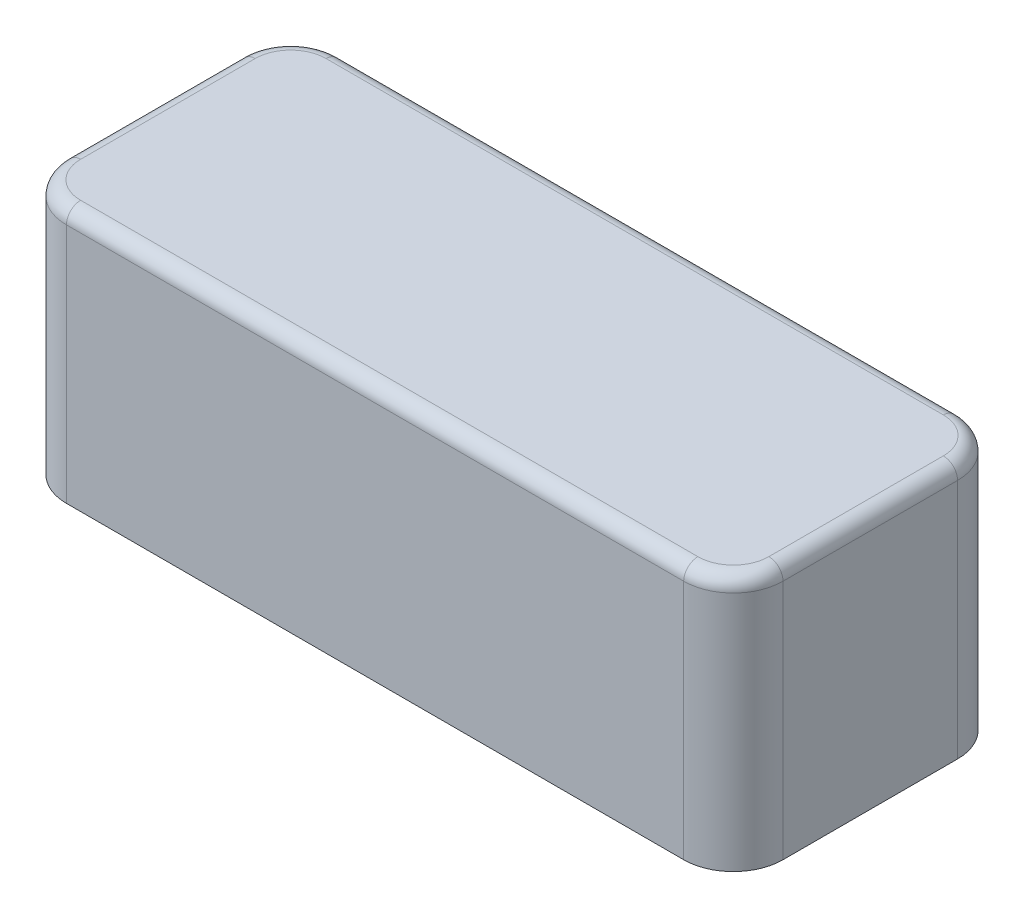
ISO-10303-21;
HEADER;
FILE_DESCRIPTION(('STEP AP214'),'2;1');
FILE_NAME('part.step','',(''),(''),'','','');
FILE_SCHEMA(('AUTOMOTIVE_DESIGN { 1 0 10303 214 1 1 1 1 }'));
ENDSEC;
DATA;
#1=APPLICATION_CONTEXT('core data for automotive mechanical design processes');
#2=APPLICATION_PROTOCOL_DEFINITION('international standard','automotive_design',2000,#1);
#3=PRODUCT_CONTEXT('',#1,'mechanical');
#4=PRODUCT('Part','Part','',(#3));
#5=PRODUCT_RELATED_PRODUCT_CATEGORY('part','',(#4));
#6=PRODUCT_DEFINITION_FORMATION('','',#4);
#7=PRODUCT_DEFINITION_CONTEXT('part definition',#1,'design');
#8=PRODUCT_DEFINITION('design','',#6,#7);
#9=PRODUCT_DEFINITION_SHAPE('','',#8);
#10=(LENGTH_UNIT() NAMED_UNIT(*) SI_UNIT(.MILLI.,.METRE.));
#11=(NAMED_UNIT(*) PLANE_ANGLE_UNIT() SI_UNIT($,.RADIAN.));
#12=(NAMED_UNIT(*) SI_UNIT($,.STERADIAN.) SOLID_ANGLE_UNIT());
#13=UNCERTAINTY_MEASURE_WITH_UNIT(LENGTH_MEASURE(1.E-05),#10,'distance_accuracy_value','');
#14=(GEOMETRIC_REPRESENTATION_CONTEXT(3) GLOBAL_UNCERTAINTY_ASSIGNED_CONTEXT((#13)) GLOBAL_UNIT_ASSIGNED_CONTEXT((#10,
#11,#12)) REPRESENTATION_CONTEXT('',''));
#15=CARTESIAN_POINT('',(0.,0.,0.));
#16=DIRECTION('',(0.,0.,1.));
#17=DIRECTION('',(1.,0.,0.));
#18=AXIS2_PLACEMENT_3D('',#15,#16,#17);
#19=CARTESIAN_POINT('',(-505.,350.,0.));
#20=DIRECTION('',(-1.,0.,0.));
#21=DIRECTION('',(0.,0.,1.));
#22=AXIS2_PLACEMENT_3D('',#19,#20,#21);
#23=PLANE('',#22);
#24=DIRECTION('',(0.,-1.,0.));
#25=VECTOR('',#24,1.);
#26=CARTESIAN_POINT('',(-505.,350.,123.));
#27=LINE('',#26,#25);
#28=CARTESIAN_POINT('',(-505.,340.,123.));
#29=VERTEX_POINT('',#28);
#30=CARTESIAN_POINT('',(-505.,0.,123.));
#31=VERTEX_POINT('',#30);
#32=EDGE_CURVE('E262',#29,#31,#27,.T.);
#33=ORIENTED_EDGE('',*,*,#32,.F.);
#34=DIRECTION('',(0.,0.,1.));
#35=VECTOR('',#34,1.);
#36=CARTESIAN_POINT('',(-505.,340.,-123.));
#37=LINE('',#36,#35);
#38=CARTESIAN_POINT('',(-505.,340.,-123.));
#39=VERTEX_POINT('',#38);
#40=EDGE_CURVE('E297',#29,#39,#37,.F.);
#41=ORIENTED_EDGE('',*,*,#40,.T.);
#42=DIRECTION('',(0.,-1.,0.));
#43=VECTOR('',#42,1.);
#44=CARTESIAN_POINT('',(-505.,350.,-123.));
#45=LINE('',#44,#43);
#46=CARTESIAN_POINT('',(-505.,0.,-123.));
#47=VERTEX_POINT('',#46);
#48=EDGE_CURVE('E248',#39,#47,#45,.T.);
#49=ORIENTED_EDGE('',*,*,#48,.T.);
#50=DIRECTION('',(0.,0.,-1.));
#51=VECTOR('',#50,1.);
#52=CARTESIAN_POINT('',(-505.,0.,0.));
#53=LINE('',#52,#51);
#54=EDGE_CURVE('E225',#31,#47,#53,.T.);
#55=ORIENTED_EDGE('',*,*,#54,.F.);
#56=EDGE_LOOP('',(#33,#41,#49,#55));
#57=FACE_BOUND('',#56,.T.);
#58=ADVANCED_FACE('F35',(#57),#23,.T.);
#59=CARTESIAN_POINT('',(-435.,350.,123.));
#60=DIRECTION('',(0.,-1.,0.));
#61=DIRECTION('',(0.,0.,-1.));
#62=AXIS2_PLACEMENT_3D('',#59,#60,#61);
#63=CYLINDRICAL_SURFACE('',#62,70.);
#64=DIRECTION('',(0.,-1.,0.));
#65=VECTOR('',#64,1.);
#66=CARTESIAN_POINT('',(-435.,350.,193.));
#67=LINE('',#66,#65);
#68=CARTESIAN_POINT('',(-435.,340.,193.));
#69=VERTEX_POINT('',#68);
#70=CARTESIAN_POINT('',(-435.,0.,193.));
#71=VERTEX_POINT('',#70);
#72=EDGE_CURVE('E260',#69,#71,#67,.T.);
#73=ORIENTED_EDGE('',*,*,#72,.F.);
#74=CARTESIAN_POINT('',(-435.,340.,123.));
#75=DIRECTION('',(0.,-1.,0.));
#76=DIRECTION('',(0.,0.,-1.));
#77=AXIS2_PLACEMENT_3D('',#74,#75,#76);
#78=CIRCLE('',#77,70.);
#79=EDGE_CURVE('E294',#69,#29,#78,.T.);
#80=ORIENTED_EDGE('',*,*,#79,.T.);
#81=ORIENTED_EDGE('',*,*,#32,.T.);
#82=CARTESIAN_POINT('',(-435.,0.,123.));
#83=DIRECTION('',(0.,1.,0.));
#84=DIRECTION('',(0.,0.,1.));
#85=AXIS2_PLACEMENT_3D('',#82,#83,#84);
#86=CIRCLE('',#85,70.);
#87=EDGE_CURVE('E228',#31,#71,#86,.T.);
#88=ORIENTED_EDGE('',*,*,#87,.T.);
#89=EDGE_LOOP('',(#73,#80,#81,#88));
#90=FACE_BOUND('',#89,.T.);
#91=ADVANCED_FACE('F356',(#90),#63,.T.);
#92=CARTESIAN_POINT('',(0.,350.,193.));
#93=DIRECTION('',(0.,0.,-1.));
#94=DIRECTION('',(-1.,0.,0.));
#95=AXIS2_PLACEMENT_3D('',#92,#93,#94);
#96=PLANE('',#95);
#97=DIRECTION('',(0.,-1.,0.));
#98=VECTOR('',#97,1.);
#99=CARTESIAN_POINT('',(434.999999999999,350.,193.));
#100=LINE('',#99,#98);
#101=CARTESIAN_POINT('',(434.999999999999,340.,193.));
#102=VERTEX_POINT('',#101);
#103=CARTESIAN_POINT('',(434.999999999999,0.,193.));
#104=VERTEX_POINT('',#103);
#105=EDGE_CURVE('E258',#102,#104,#100,.T.);
#106=ORIENTED_EDGE('',*,*,#105,.F.);
#107=DIRECTION('',(1.,0.,0.));
#108=VECTOR('',#107,1.);
#109=CARTESIAN_POINT('',(0.,340.,193.));
#110=LINE('',#109,#108);
#111=EDGE_CURVE('E11',#102,#69,#110,.F.);
#112=ORIENTED_EDGE('',*,*,#111,.T.);
#113=ORIENTED_EDGE('',*,*,#72,.T.);
#114=DIRECTION('',(1.,0.,0.));
#115=VECTOR('',#114,1.);
#116=CARTESIAN_POINT('',(0.,0.,193.));
#117=LINE('',#116,#115);
#118=EDGE_CURVE('E231',#71,#104,#117,.T.);
#119=ORIENTED_EDGE('',*,*,#118,.T.);
#120=EDGE_LOOP('',(#106,#112,#113,#119));
#121=FACE_BOUND('',#120,.T.);
#122=ADVANCED_FACE('F351',(#121),#96,.F.);
#123=CARTESIAN_POINT('',(435.,350.,123.));
#124=DIRECTION('',(0.,-1.,0.));
#125=DIRECTION('',(0.,0.,-1.));
#126=AXIS2_PLACEMENT_3D('',#123,#124,#125);
#127=CYLINDRICAL_SURFACE('',#126,70.);
#128=DIRECTION('',(0.,-1.,0.));
#129=VECTOR('',#128,1.);
#130=CARTESIAN_POINT('',(505.,350.,123.));
#131=LINE('',#130,#129);
#132=CARTESIAN_POINT('',(505.,340.,123.));
#133=VERTEX_POINT('',#132);
#134=CARTESIAN_POINT('',(505.,0.,123.));
#135=VERTEX_POINT('',#134);
#136=EDGE_CURVE('E256',#133,#135,#131,.T.);
#137=ORIENTED_EDGE('',*,*,#136,.F.);
#138=CARTESIAN_POINT('',(435.,340.,123.));
#139=DIRECTION('',(0.,-1.,0.));
#140=DIRECTION('',(0.,0.,-1.));
#141=AXIS2_PLACEMENT_3D('',#138,#139,#140);
#142=CIRCLE('',#141,70.);
#143=EDGE_CURVE('E44',#133,#102,#142,.T.);
#144=ORIENTED_EDGE('',*,*,#143,.T.);
#145=ORIENTED_EDGE('',*,*,#105,.T.);
#146=CARTESIAN_POINT('',(435.,0.,123.));
#147=DIRECTION('',(0.,1.,0.));
#148=DIRECTION('',(0.,0.,1.));
#149=AXIS2_PLACEMENT_3D('',#146,#147,#148);
#150=CIRCLE('',#149,70.);
#151=EDGE_CURVE('E234',#135,#104,#150,.F.);
#152=ORIENTED_EDGE('',*,*,#151,.F.);
#153=EDGE_LOOP('',(#137,#144,#145,#152));
#154=FACE_BOUND('',#153,.T.);
#155=ADVANCED_FACE('F347',(#154),#127,.T.);
#156=CARTESIAN_POINT('',(505.,350.,0.));
#157=DIRECTION('',(-1.,0.,0.));
#158=DIRECTION('',(0.,0.,1.));
#159=AXIS2_PLACEMENT_3D('',#156,#157,#158);
#160=PLANE('',#159);
#161=DIRECTION('',(0.,-1.,0.));
#162=VECTOR('',#161,1.);
#163=CARTESIAN_POINT('',(505.,350.,-123.));
#164=LINE('',#163,#162);
#165=CARTESIAN_POINT('',(505.,340.,-123.));
#166=VERTEX_POINT('',#165);
#167=CARTESIAN_POINT('',(505.,0.,-123.));
#168=VERTEX_POINT('',#167);
#169=EDGE_CURVE('E254',#166,#168,#164,.T.);
#170=ORIENTED_EDGE('',*,*,#169,.F.);
#171=DIRECTION('',(0.,0.,-1.));
#172=VECTOR('',#171,1.);
#173=CARTESIAN_POINT('',(505.,340.,0.));
#174=LINE('',#173,#172);
#175=EDGE_CURVE('E59',#166,#133,#174,.F.);
#176=ORIENTED_EDGE('',*,*,#175,.T.);
#177=ORIENTED_EDGE('',*,*,#136,.T.);
#178=DIRECTION('',(0.,0.,-1.));
#179=VECTOR('',#178,1.);
#180=CARTESIAN_POINT('',(505.,0.,0.));
#181=LINE('',#180,#179);
#182=EDGE_CURVE('E237',#135,#168,#181,.T.);
#183=ORIENTED_EDGE('',*,*,#182,.T.);
#184=EDGE_LOOP('',(#170,#176,#177,#183));
#185=FACE_BOUND('',#184,.T.);
#186=ADVANCED_FACE('F341',(#185),#160,.F.);
#187=CARTESIAN_POINT('',(435.,350.,-123.));
#188=DIRECTION('',(0.,-1.,0.));
#189=DIRECTION('',(0.,0.,-1.));
#190=AXIS2_PLACEMENT_3D('',#187,#188,#189);
#191=CYLINDRICAL_SURFACE('',#190,70.);
#192=DIRECTION('',(0.,-1.,0.));
#193=VECTOR('',#192,1.);
#194=CARTESIAN_POINT('',(435.,350.,-193.));
#195=LINE('',#194,#193);
#196=CARTESIAN_POINT('',(435.,340.,-193.));
#197=VERTEX_POINT('',#196);
#198=CARTESIAN_POINT('',(435.,0.,-193.));
#199=VERTEX_POINT('',#198);
#200=EDGE_CURVE('E252',#197,#199,#195,.T.);
#201=ORIENTED_EDGE('',*,*,#200,.F.);
#202=CARTESIAN_POINT('',(435.,340.,-123.));
#203=DIRECTION('',(0.,-1.,0.));
#204=DIRECTION('',(0.,0.,-1.));
#205=AXIS2_PLACEMENT_3D('',#202,#203,#204);
#206=CIRCLE('',#205,70.);
#207=EDGE_CURVE('E303',#197,#166,#206,.T.);
#208=ORIENTED_EDGE('',*,*,#207,.T.);
#209=ORIENTED_EDGE('',*,*,#169,.T.);
#210=CARTESIAN_POINT('',(435.,0.,-123.));
#211=DIRECTION('',(0.,1.,0.));
#212=DIRECTION('',(0.,0.,1.));
#213=AXIS2_PLACEMENT_3D('',#210,#211,#212);
#214=CIRCLE('',#213,70.);
#215=EDGE_CURVE('E240',#168,#199,#214,.T.);
#216=ORIENTED_EDGE('',*,*,#215,.T.);
#217=EDGE_LOOP('',(#201,#208,#209,#216));
#218=FACE_BOUND('',#217,.T.);
#219=ADVANCED_FACE('F339',(#218),#191,.T.);
#220=CARTESIAN_POINT('',(0.,350.,-193.));
#221=DIRECTION('',(0.,0.,-1.));
#222=DIRECTION('',(-1.,0.,0.));
#223=AXIS2_PLACEMENT_3D('',#220,#221,#222);
#224=PLANE('',#223);
#225=DIRECTION('',(0.,-1.,0.));
#226=VECTOR('',#225,1.);
#227=CARTESIAN_POINT('',(-435.,350.,-193.));
#228=LINE('',#227,#226);
#229=CARTESIAN_POINT('',(-435.,340.,-193.));
#230=VERTEX_POINT('',#229);
#231=CARTESIAN_POINT('',(-435.,0.,-193.));
#232=VERTEX_POINT('',#231);
#233=EDGE_CURVE('E250',#230,#232,#228,.T.);
#234=ORIENTED_EDGE('',*,*,#233,.F.);
#235=DIRECTION('',(-1.,0.,0.));
#236=VECTOR('',#235,1.);
#237=CARTESIAN_POINT('',(434.999999999999,340.,-193.));
#238=LINE('',#237,#236);
#239=EDGE_CURVE('E301',#230,#197,#238,.F.);
#240=ORIENTED_EDGE('',*,*,#239,.T.);
#241=ORIENTED_EDGE('',*,*,#200,.T.);
#242=DIRECTION('',(1.,0.,0.));
#243=VECTOR('',#242,1.);
#244=CARTESIAN_POINT('',(0.,0.,-193.));
#245=LINE('',#244,#243);
#246=EDGE_CURVE('E243',#232,#199,#245,.T.);
#247=ORIENTED_EDGE('',*,*,#246,.F.);
#248=EDGE_LOOP('',(#234,#240,#241,#247));
#249=FACE_BOUND('',#248,.T.);
#250=ADVANCED_FACE('F369',(#249),#224,.T.);
#251=CARTESIAN_POINT('',(435.,350.,-123.));
#252=DIRECTION('',(0.,-1.,0.));
#253=DIRECTION('',(0.,0.,-1.));
#254=AXIS2_PLACEMENT_3D('',#251,#252,#253);
#255=CYLINDRICAL_SURFACE('',#254,60.);
#256=CARTESIAN_POINT('',(435.,0.,-123.));
#257=DIRECTION('',(0.,1.,0.));
#258=DIRECTION('',(0.,0.,1.));
#259=AXIS2_PLACEMENT_3D('',#256,#257,#258);
#260=CIRCLE('',#259,60.);
#261=CARTESIAN_POINT('',(495.,0.,-123.));
#262=VERTEX_POINT('',#261);
#263=CARTESIAN_POINT('',(435.,0.,-183.));
#264=VERTEX_POINT('',#263);
#265=EDGE_CURVE('E206',#262,#264,#260,.T.);
#266=ORIENTED_EDGE('',*,*,#265,.F.);
#267=DIRECTION('',(0.,-1.,0.));
#268=VECTOR('',#267,1.);
#269=CARTESIAN_POINT('',(495.,350.,-123.));
#270=LINE('',#269,#268);
#271=CARTESIAN_POINT('',(495.,350.,-123.));
#272=VERTEX_POINT('',#271);
#273=EDGE_CURVE('E178',#272,#262,#270,.T.);
#274=ORIENTED_EDGE('',*,*,#273,.F.);
#275=CARTESIAN_POINT('',(435.,350.,-123.));
#276=DIRECTION('',(0.,1.,0.));
#277=DIRECTION('',(0.,0.,1.));
#278=AXIS2_PLACEMENT_3D('',#275,#276,#277);
#279=CIRCLE('',#278,60.);
#280=CARTESIAN_POINT('',(435.,350.,-183.));
#281=VERTEX_POINT('',#280);
#282=EDGE_CURVE('E172',#272,#281,#279,.T.);
#283=ORIENTED_EDGE('',*,*,#282,.T.);
#284=DIRECTION('',(0.,-1.,0.));
#285=VECTOR('',#284,1.);
#286=CARTESIAN_POINT('',(435.,350.,-183.));
#287=LINE('',#286,#285);
#288=EDGE_CURVE('E176',#281,#264,#287,.T.);
#289=ORIENTED_EDGE('',*,*,#288,.T.);
#290=EDGE_LOOP('',(#266,#274,#283,#289));
#291=FACE_BOUND('',#290,.T.);
#292=ADVANCED_FACE('F175',(#291),#255,.F.);
#293=CARTESIAN_POINT('',(495.,350.,0.));
#294=DIRECTION('',(-1.,0.,0.));
#295=DIRECTION('',(0.,0.,1.));
#296=AXIS2_PLACEMENT_3D('',#293,#294,#295);
#297=PLANE('',#296);
#298=DIRECTION('',(0.,0.,-1.));
#299=VECTOR('',#298,1.);
#300=CARTESIAN_POINT('',(495.,0.,0.));
#301=LINE('',#300,#299);
#302=CARTESIAN_POINT('',(495.,0.,123.));
#303=VERTEX_POINT('',#302);
#304=EDGE_CURVE('E208',#303,#262,#301,.T.);
#305=ORIENTED_EDGE('',*,*,#304,.F.);
#306=DIRECTION('',(0.,-1.,0.));
#307=VECTOR('',#306,1.);
#308=CARTESIAN_POINT('',(495.,350.,123.));
#309=LINE('',#308,#307);
#310=CARTESIAN_POINT('',(495.,350.,123.));
#311=VERTEX_POINT('',#310);
#312=EDGE_CURVE('E275',#311,#303,#309,.T.);
#313=ORIENTED_EDGE('',*,*,#312,.F.);
#314=DIRECTION('',(0.,0.,-1.));
#315=VECTOR('',#314,1.);
#316=CARTESIAN_POINT('',(495.,350.,0.));
#317=LINE('',#316,#315);
#318=EDGE_CURVE('E183',#311,#272,#317,.T.);
#319=ORIENTED_EDGE('',*,*,#318,.T.);
#320=ORIENTED_EDGE('',*,*,#273,.T.);
#321=EDGE_LOOP('',(#305,#313,#319,#320));
#322=FACE_BOUND('',#321,.T.);
#323=ADVANCED_FACE('F376',(#322),#297,.T.);
#324=CARTESIAN_POINT('',(435.,350.,123.));
#325=DIRECTION('',(0.,-1.,0.));
#326=DIRECTION('',(0.,0.,-1.));
#327=AXIS2_PLACEMENT_3D('',#324,#325,#326);
#328=CYLINDRICAL_SURFACE('',#327,60.);
#329=CARTESIAN_POINT('',(435.,0.,123.));
#330=DIRECTION('',(0.,1.,0.));
#331=DIRECTION('',(0.,0.,1.));
#332=AXIS2_PLACEMENT_3D('',#329,#330,#331);
#333=CIRCLE('',#332,60.);
#334=CARTESIAN_POINT('',(435.,0.,183.));
#335=VERTEX_POINT('',#334);
#336=EDGE_CURVE('E211',#303,#335,#333,.F.);
#337=ORIENTED_EDGE('',*,*,#336,.T.);
#338=DIRECTION('',(0.,-1.,0.));
#339=VECTOR('',#338,1.);
#340=CARTESIAN_POINT('',(435.,350.,183.));
#341=LINE('',#340,#339);
#342=CARTESIAN_POINT('',(435.,350.,183.));
#343=VERTEX_POINT('',#342);
#344=EDGE_CURVE('E273',#343,#335,#341,.T.);
#345=ORIENTED_EDGE('',*,*,#344,.F.);
#346=CARTESIAN_POINT('',(435.,350.,123.));
#347=DIRECTION('',(0.,1.,0.));
#348=DIRECTION('',(0.,0.,1.));
#349=AXIS2_PLACEMENT_3D('',#346,#347,#348);
#350=CIRCLE('',#349,60.);
#351=EDGE_CURVE('E639',#311,#343,#350,.F.);
#352=ORIENTED_EDGE('',*,*,#351,.F.);
#353=ORIENTED_EDGE('',*,*,#312,.T.);
#354=EDGE_LOOP('',(#337,#345,#352,#353));
#355=FACE_BOUND('',#354,.T.);
#356=ADVANCED_FACE('F405',(#355),#328,.F.);
#357=CARTESIAN_POINT('',(0.,350.,183.));
#358=DIRECTION('',(0.,0.,-1.));
#359=DIRECTION('',(-1.,0.,0.));
#360=AXIS2_PLACEMENT_3D('',#357,#358,#359);
#361=PLANE('',#360);
#362=DIRECTION('',(1.,0.,0.));
#363=VECTOR('',#362,1.);
#364=CARTESIAN_POINT('',(0.,0.,183.));
#365=LINE('',#364,#363);
#366=CARTESIAN_POINT('',(-435.,0.,183.));
#367=VERTEX_POINT('',#366);
#368=EDGE_CURVE('E214',#367,#335,#365,.T.);
#369=ORIENTED_EDGE('',*,*,#368,.F.);
#370=DIRECTION('',(0.,-1.,0.));
#371=VECTOR('',#370,1.);
#372=CARTESIAN_POINT('',(-435.,350.,183.));
#373=LINE('',#372,#371);
#374=CARTESIAN_POINT('',(-435.,350.,183.));
#375=VERTEX_POINT('',#374);
#376=EDGE_CURVE('E271',#375,#367,#373,.T.);
#377=ORIENTED_EDGE('',*,*,#376,.F.);
#378=DIRECTION('',(1.,0.,0.));
#379=VECTOR('',#378,1.);
#380=CARTESIAN_POINT('',(0.,350.,183.));
#381=LINE('',#380,#379);
#382=EDGE_CURVE('E641',#375,#343,#381,.T.);
#383=ORIENTED_EDGE('',*,*,#382,.T.);
#384=ORIENTED_EDGE('',*,*,#344,.T.);
#385=EDGE_LOOP('',(#369,#377,#383,#384));
#386=FACE_BOUND('',#385,.T.);
#387=ADVANCED_FACE('F401',(#386),#361,.T.);
#388=CARTESIAN_POINT('',(-435.,350.,123.));
#389=DIRECTION('',(0.,-1.,0.));
#390=DIRECTION('',(0.,0.,-1.));
#391=AXIS2_PLACEMENT_3D('',#388,#389,#390);
#392=CYLINDRICAL_SURFACE('',#391,60.);
#393=CARTESIAN_POINT('',(-435.,0.,123.));
#394=DIRECTION('',(0.,1.,0.));
#395=DIRECTION('',(0.,0.,1.));
#396=AXIS2_PLACEMENT_3D('',#393,#394,#395);
#397=CIRCLE('',#396,60.);
#398=CARTESIAN_POINT('',(-495.,0.,123.));
#399=VERTEX_POINT('',#398);
#400=EDGE_CURVE('E217',#399,#367,#397,.T.);
#401=ORIENTED_EDGE('',*,*,#400,.F.);
#402=DIRECTION('',(0.,-1.,0.));
#403=VECTOR('',#402,1.);
#404=CARTESIAN_POINT('',(-495.,350.,123.));
#405=LINE('',#404,#403);
#406=CARTESIAN_POINT('',(-495.,350.,123.));
#407=VERTEX_POINT('',#406);
#408=EDGE_CURVE('E269',#407,#399,#405,.T.);
#409=ORIENTED_EDGE('',*,*,#408,.F.);
#410=CARTESIAN_POINT('',(-435.,350.,123.));
#411=DIRECTION('',(0.,1.,0.));
#412=DIRECTION('',(0.,0.,1.));
#413=AXIS2_PLACEMENT_3D('',#410,#411,#412);
#414=CIRCLE('',#413,60.);
#415=EDGE_CURVE('E646',#407,#375,#414,.T.);
#416=ORIENTED_EDGE('',*,*,#415,.T.);
#417=ORIENTED_EDGE('',*,*,#376,.T.);
#418=EDGE_LOOP('',(#401,#409,#416,#417));
#419=FACE_BOUND('',#418,.T.);
#420=ADVANCED_FACE('F397',(#419),#392,.F.);
#421=CARTESIAN_POINT('',(-495.,350.,0.));
#422=DIRECTION('',(-1.,0.,0.));
#423=DIRECTION('',(0.,0.,1.));
#424=AXIS2_PLACEMENT_3D('',#421,#422,#423);
#425=PLANE('',#424);
#426=DIRECTION('',(0.,0.,-1.));
#427=VECTOR('',#426,1.);
#428=CARTESIAN_POINT('',(-495.,0.,0.));
#429=LINE('',#428,#427);
#430=CARTESIAN_POINT('',(-495.,0.,-123.));
#431=VERTEX_POINT('',#430);
#432=EDGE_CURVE('E220',#399,#431,#429,.T.);
#433=ORIENTED_EDGE('',*,*,#432,.T.);
#434=DIRECTION('',(0.,-1.,0.));
#435=VECTOR('',#434,1.);
#436=CARTESIAN_POINT('',(-495.,350.,-123.));
#437=LINE('',#436,#435);
#438=CARTESIAN_POINT('',(-495.,350.,-123.));
#439=VERTEX_POINT('',#438);
#440=EDGE_CURVE('E266',#439,#431,#437,.T.);
#441=ORIENTED_EDGE('',*,*,#440,.F.);
#442=DIRECTION('',(0.,0.,-1.));
#443=VECTOR('',#442,1.);
#444=CARTESIAN_POINT('',(-495.,350.,0.));
#445=LINE('',#444,#443);
#446=EDGE_CURVE('E202',#407,#439,#445,.T.);
#447=ORIENTED_EDGE('',*,*,#446,.F.);
#448=ORIENTED_EDGE('',*,*,#408,.T.);
#449=EDGE_LOOP('',(#433,#441,#447,#448));
#450=FACE_BOUND('',#449,.T.);
#451=ADVANCED_FACE('F393',(#450),#425,.F.);
#452=CARTESIAN_POINT('',(-435.,350.,-123.));
#453=DIRECTION('',(0.,-1.,0.));
#454=DIRECTION('',(0.,0.,-1.));
#455=AXIS2_PLACEMENT_3D('',#452,#453,#454);
#456=CYLINDRICAL_SURFACE('',#455,60.);
#457=CARTESIAN_POINT('',(-435.,0.,-123.));
#458=DIRECTION('',(0.,1.,0.));
#459=DIRECTION('',(0.,0.,1.));
#460=AXIS2_PLACEMENT_3D('',#457,#458,#459);
#461=CIRCLE('',#460,60.);
#462=CARTESIAN_POINT('',(-435.,0.,-183.));
#463=VERTEX_POINT('',#462);
#464=EDGE_CURVE('E222',#431,#463,#461,.F.);
#465=ORIENTED_EDGE('',*,*,#464,.T.);
#466=DIRECTION('',(0.,-1.,0.));
#467=VECTOR('',#466,1.);
#468=CARTESIAN_POINT('',(-435.,350.,-183.));
#469=LINE('',#468,#467);
#470=CARTESIAN_POINT('',(-435.,350.,-183.));
#471=VERTEX_POINT('',#470);
#472=EDGE_CURVE('E195',#471,#463,#469,.T.);
#473=ORIENTED_EDGE('',*,*,#472,.F.);
#474=CARTESIAN_POINT('',(-435.,350.,-123.));
#475=DIRECTION('',(0.,1.,0.));
#476=DIRECTION('',(0.,0.,1.));
#477=AXIS2_PLACEMENT_3D('',#474,#475,#476);
#478=CIRCLE('',#477,60.);
#479=EDGE_CURVE('E200',#439,#471,#478,.F.);
#480=ORIENTED_EDGE('',*,*,#479,.F.);
#481=ORIENTED_EDGE('',*,*,#440,.T.);
#482=EDGE_LOOP('',(#465,#473,#480,#481));
#483=FACE_BOUND('',#482,.T.);
#484=ADVANCED_FACE('F390',(#483),#456,.F.);
#485=CARTESIAN_POINT('',(0.,350.,-183.));
#486=DIRECTION('',(0.,0.,-1.));
#487=DIRECTION('',(-1.,0.,0.));
#488=AXIS2_PLACEMENT_3D('',#485,#486,#487);
#489=PLANE('',#488);
#490=DIRECTION('',(1.,0.,0.));
#491=VECTOR('',#490,1.);
#492=CARTESIAN_POINT('',(0.,0.,-183.));
#493=LINE('',#492,#491);
#494=EDGE_CURVE('E193',#463,#264,#493,.T.);
#495=ORIENTED_EDGE('',*,*,#494,.T.);
#496=ORIENTED_EDGE('',*,*,#288,.F.);
#497=DIRECTION('',(1.,0.,0.));
#498=VECTOR('',#497,1.);
#499=CARTESIAN_POINT('',(0.,350.,-183.));
#500=LINE('',#499,#498);
#501=EDGE_CURVE('E190',#471,#281,#500,.T.);
#502=ORIENTED_EDGE('',*,*,#501,.F.);
#503=ORIENTED_EDGE('',*,*,#472,.T.);
#504=EDGE_LOOP('',(#495,#496,#502,#503));
#505=FACE_BOUND('',#504,.T.);
#506=ADVANCED_FACE('F188',(#505),#489,.F.);
#507=CARTESIAN_POINT('',(-435.,350.,-123.));
#508=DIRECTION('',(0.,-1.,0.));
#509=DIRECTION('',(0.,0.,-1.));
#510=AXIS2_PLACEMENT_3D('',#507,#508,#509);
#511=CYLINDRICAL_SURFACE('',#510,70.);
#512=ORIENTED_EDGE('',*,*,#48,.F.);
#513=CARTESIAN_POINT('',(-435.,340.,-123.));
#514=DIRECTION('',(0.,-1.,0.));
#515=DIRECTION('',(0.,0.,-1.));
#516=AXIS2_PLACEMENT_3D('',#513,#514,#515);
#517=CIRCLE('',#516,70.);
#518=EDGE_CURVE('E299',#39,#230,#517,.T.);
#519=ORIENTED_EDGE('',*,*,#518,.T.);
#520=ORIENTED_EDGE('',*,*,#233,.T.);
#521=CARTESIAN_POINT('',(-435.,0.,-123.));
#522=DIRECTION('',(0.,1.,0.));
#523=DIRECTION('',(0.,0.,1.));
#524=AXIS2_PLACEMENT_3D('',#521,#522,#523);
#525=CIRCLE('',#524,70.);
#526=EDGE_CURVE('E184',#47,#232,#525,.F.);
#527=ORIENTED_EDGE('',*,*,#526,.F.);
#528=EDGE_LOOP('',(#512,#519,#520,#527));
#529=FACE_BOUND('',#528,.T.);
#530=ADVANCED_FACE('F364',(#529),#511,.T.);
#531=CARTESIAN_POINT('',(0.,0.,0.));
#532=DIRECTION('',(0.,1.,0.));
#533=DIRECTION('',(0.,0.,1.));
#534=AXIS2_PLACEMENT_3D('',#531,#532,#533);
#535=PLANE('',#534);
#536=ORIENTED_EDGE('',*,*,#265,.T.);
#537=ORIENTED_EDGE('',*,*,#494,.F.);
#538=ORIENTED_EDGE('',*,*,#464,.F.);
#539=ORIENTED_EDGE('',*,*,#432,.F.);
#540=ORIENTED_EDGE('',*,*,#400,.T.);
#541=ORIENTED_EDGE('',*,*,#368,.T.);
#542=ORIENTED_EDGE('',*,*,#336,.F.);
#543=ORIENTED_EDGE('',*,*,#304,.T.);
#544=EDGE_LOOP('',(#536,#537,#538,#539,#540,#541,#542,#543));
#545=FACE_BOUND('',#544,.T.);
#546=ORIENTED_EDGE('',*,*,#54,.T.);
#547=ORIENTED_EDGE('',*,*,#526,.T.);
#548=ORIENTED_EDGE('',*,*,#246,.T.);
#549=ORIENTED_EDGE('',*,*,#215,.F.);
#550=ORIENTED_EDGE('',*,*,#182,.F.);
#551=ORIENTED_EDGE('',*,*,#151,.T.);
#552=ORIENTED_EDGE('',*,*,#118,.F.);
#553=ORIENTED_EDGE('',*,*,#87,.F.);
#554=EDGE_LOOP('',(#546,#547,#548,#549,#550,#551,#552,#553));
#555=FACE_BOUND('',#554,.T.);
#556=ADVANCED_FACE('F345',(#545,#555),#535,.F.);
#557=CARTESIAN_POINT('',(435.,360.,-123.));
#558=DIRECTION('',(0.,-1.,0.));
#559=DIRECTION('',(0.,0.,-1.));
#560=AXIS2_PLACEMENT_3D('',#557,#558,#559);
#561=PLANE('',#560);
#562=DIRECTION('',(0.,0.,1.));
#563=VECTOR('',#562,1.);
#564=CARTESIAN_POINT('',(-485.,360.,123.));
#565=LINE('',#564,#563);
#566=CARTESIAN_POINT('',(-485.,360.,-123.));
#567=VERTEX_POINT('',#566);
#568=CARTESIAN_POINT('',(-485.,360.,123.));
#569=VERTEX_POINT('',#568);
#570=EDGE_CURVE('E289',#567,#569,#565,.T.);
#571=ORIENTED_EDGE('',*,*,#570,.T.);
#572=CARTESIAN_POINT('',(-435.,360.,123.));
#573=DIRECTION('',(0.,-1.,0.));
#574=DIRECTION('',(0.,0.,-1.));
#575=AXIS2_PLACEMENT_3D('',#572,#573,#574);
#576=CIRCLE('',#575,50.);
#577=CARTESIAN_POINT('',(-435.,360.,173.));
#578=VERTEX_POINT('',#577);
#579=EDGE_CURVE('E291',#569,#578,#576,.F.);
#580=ORIENTED_EDGE('',*,*,#579,.T.);
#581=DIRECTION('',(1.,0.,0.));
#582=VECTOR('',#581,1.);
#583=CARTESIAN_POINT('',(435.,360.,173.));
#584=LINE('',#583,#582);
#585=CARTESIAN_POINT('',(435.,360.,173.));
#586=VERTEX_POINT('',#585);
#587=EDGE_CURVE('E263',#578,#586,#584,.T.);
#588=ORIENTED_EDGE('',*,*,#587,.T.);
#589=CARTESIAN_POINT('',(435.,360.,123.));
#590=DIRECTION('',(0.,-1.,0.));
#591=DIRECTION('',(0.,0.,-1.));
#592=AXIS2_PLACEMENT_3D('',#589,#590,#591);
#593=CIRCLE('',#592,50.);
#594=CARTESIAN_POINT('',(485.,360.,123.));
#595=VERTEX_POINT('',#594);
#596=EDGE_CURVE('E279',#586,#595,#593,.F.);
#597=ORIENTED_EDGE('',*,*,#596,.T.);
#598=DIRECTION('',(0.,0.,-1.));
#599=VECTOR('',#598,1.);
#600=CARTESIAN_POINT('',(485.,360.,-123.));
#601=LINE('',#600,#599);
#602=CARTESIAN_POINT('',(485.,360.,-123.));
#603=VERTEX_POINT('',#602);
#604=EDGE_CURVE('E281',#595,#603,#601,.T.);
#605=ORIENTED_EDGE('',*,*,#604,.T.);
#606=CARTESIAN_POINT('',(435.,360.,-123.));
#607=DIRECTION('',(0.,-1.,0.));
#608=DIRECTION('',(0.,0.,-1.));
#609=AXIS2_PLACEMENT_3D('',#606,#607,#608);
#610=CIRCLE('',#609,50.);
#611=CARTESIAN_POINT('',(435.,360.,-173.));
#612=VERTEX_POINT('',#611);
#613=EDGE_CURVE('E283',#603,#612,#610,.F.);
#614=ORIENTED_EDGE('',*,*,#613,.T.);
#615=DIRECTION('',(-1.,0.,0.));
#616=VECTOR('',#615,1.);
#617=CARTESIAN_POINT('',(-434.999999999999,360.,-173.));
#618=LINE('',#617,#616);
#619=CARTESIAN_POINT('',(-435.,360.,-173.));
#620=VERTEX_POINT('',#619);
#621=EDGE_CURVE('E285',#612,#620,#618,.T.);
#622=ORIENTED_EDGE('',*,*,#621,.T.);
#623=CARTESIAN_POINT('',(-435.,360.,-123.));
#624=DIRECTION('',(0.,-1.,0.));
#625=DIRECTION('',(0.,0.,-1.));
#626=AXIS2_PLACEMENT_3D('',#623,#624,#625);
#627=CIRCLE('',#626,50.);
#628=EDGE_CURVE('E287',#620,#567,#627,.F.);
#629=ORIENTED_EDGE('',*,*,#628,.T.);
#630=EDGE_LOOP('',(#571,#580,#588,#597,#605,#614,#622,#629));
#631=FACE_BOUND('',#630,.T.);
#632=ADVANCED_FACE('F442',(#631),#561,.F.);
#633=CARTESIAN_POINT('',(435.,350.,-123.));
#634=DIRECTION('',(0.,-1.,0.));
#635=DIRECTION('',(0.,0.,-1.));
#636=AXIS2_PLACEMENT_3D('',#633,#634,#635);
#637=PLANE('',#636);
#638=ORIENTED_EDGE('',*,*,#501,.T.);
#639=ORIENTED_EDGE('',*,*,#282,.F.);
#640=ORIENTED_EDGE('',*,*,#318,.F.);
#641=ORIENTED_EDGE('',*,*,#351,.T.);
#642=ORIENTED_EDGE('',*,*,#382,.F.);
#643=ORIENTED_EDGE('',*,*,#415,.F.);
#644=ORIENTED_EDGE('',*,*,#446,.T.);
#645=ORIENTED_EDGE('',*,*,#479,.T.);
#646=EDGE_LOOP('',(#638,#639,#640,#641,#642,#643,#644,#645));
#647=FACE_BOUND('',#646,.T.);
#648=ADVANCED_FACE('F197',(#647),#637,.T.);
#649=CARTESIAN_POINT('',(435.,340.,-123.));
#650=DIRECTION('',(0.,-1.,0.));
#651=DIRECTION('',(0.,0.,-1.));
#652=AXIS2_PLACEMENT_3D('',#649,#650,#651);
#653=TOROIDAL_SURFACE('',#652,50.,20.);
#654=CARTESIAN_POINT('',(485.,340.,-123.));
#655=DIRECTION('',(0.,0.,1.));
#656=DIRECTION('',(1.,0.,0.));
#657=AXIS2_PLACEMENT_3D('',#654,#655,#656);
#658=CIRCLE('',#657,20.);
#659=EDGE_CURVE('E322',#166,#603,#658,.T.);
#660=ORIENTED_EDGE('',*,*,#659,.F.);
#661=ORIENTED_EDGE('',*,*,#207,.F.);
#662=CARTESIAN_POINT('',(435.,340.,-173.));
#663=DIRECTION('',(-1.,0.,0.));
#664=DIRECTION('',(0.,0.,1.));
#665=AXIS2_PLACEMENT_3D('',#662,#663,#664);
#666=CIRCLE('',#665,20.);
#667=EDGE_CURVE('E39',#612,#197,#666,.T.);
#668=ORIENTED_EDGE('',*,*,#667,.F.);
#669=ORIENTED_EDGE('',*,*,#613,.F.);
#670=EDGE_LOOP('',(#660,#661,#668,#669));
#671=FACE_BOUND('',#670,.T.);
#672=ADVANCED_FACE('F37',(#671),#653,.T.);
#673=CARTESIAN_POINT('',(435.,340.,-173.));
#674=DIRECTION('',(1.,0.,0.));
#675=DIRECTION('',(0.,0.,-1.));
#676=AXIS2_PLACEMENT_3D('',#673,#674,#675);
#677=CYLINDRICAL_SURFACE('',#676,20.);
#678=ORIENTED_EDGE('',*,*,#667,.T.);
#679=ORIENTED_EDGE('',*,*,#239,.F.);
#680=CARTESIAN_POINT('',(-435.,340.,-173.));
#681=DIRECTION('',(-1.,0.,0.));
#682=DIRECTION('',(0.,0.,1.));
#683=AXIS2_PLACEMENT_3D('',#680,#681,#682);
#684=CIRCLE('',#683,20.);
#685=EDGE_CURVE('E320',#620,#230,#684,.T.);
#686=ORIENTED_EDGE('',*,*,#685,.F.);
#687=ORIENTED_EDGE('',*,*,#621,.F.);
#688=EDGE_LOOP('',(#678,#679,#686,#687));
#689=FACE_BOUND('',#688,.T.);
#690=ADVANCED_FACE('F332',(#689),#677,.T.);
#691=CARTESIAN_POINT('',(485.,340.,-123.));
#692=DIRECTION('',(0.,0.,-1.));
#693=DIRECTION('',(-1.,0.,0.));
#694=AXIS2_PLACEMENT_3D('',#691,#692,#693);
#695=CYLINDRICAL_SURFACE('',#694,20.);
#696=ORIENTED_EDGE('',*,*,#659,.T.);
#697=ORIENTED_EDGE('',*,*,#604,.F.);
#698=CARTESIAN_POINT('',(485.,340.,123.));
#699=DIRECTION('',(0.,0.,1.));
#700=DIRECTION('',(1.,0.,0.));
#701=AXIS2_PLACEMENT_3D('',#698,#699,#700);
#702=CIRCLE('',#701,20.);
#703=EDGE_CURVE('E317',#133,#595,#702,.T.);
#704=ORIENTED_EDGE('',*,*,#703,.F.);
#705=ORIENTED_EDGE('',*,*,#175,.F.);
#706=EDGE_LOOP('',(#696,#697,#704,#705));
#707=FACE_BOUND('',#706,.T.);
#708=ADVANCED_FACE('F432',(#707),#695,.T.);
#709=CARTESIAN_POINT('',(-435.,340.,-123.));
#710=DIRECTION('',(0.,-1.,0.));
#711=DIRECTION('',(0.,0.,-1.));
#712=AXIS2_PLACEMENT_3D('',#709,#710,#711);
#713=TOROIDAL_SURFACE('',#712,50.,20.);
#714=ORIENTED_EDGE('',*,*,#685,.T.);
#715=ORIENTED_EDGE('',*,*,#518,.F.);
#716=CARTESIAN_POINT('',(-485.,340.,-123.));
#717=DIRECTION('',(0.,0.,1.));
#718=DIRECTION('',(1.,0.,0.));
#719=AXIS2_PLACEMENT_3D('',#716,#717,#718);
#720=CIRCLE('',#719,20.);
#721=EDGE_CURVE('E314',#567,#39,#720,.T.);
#722=ORIENTED_EDGE('',*,*,#721,.F.);
#723=ORIENTED_EDGE('',*,*,#628,.F.);
#724=EDGE_LOOP('',(#714,#715,#722,#723));
#725=FACE_BOUND('',#724,.T.);
#726=ADVANCED_FACE('F428',(#725),#713,.T.);
#727=CARTESIAN_POINT('',(435.,340.,123.));
#728=DIRECTION('',(0.,-1.,0.));
#729=DIRECTION('',(0.,0.,-1.));
#730=AXIS2_PLACEMENT_3D('',#727,#728,#729);
#731=TOROIDAL_SURFACE('',#730,50.,20.);
#732=ORIENTED_EDGE('',*,*,#703,.T.);
#733=ORIENTED_EDGE('',*,*,#596,.F.);
#734=CARTESIAN_POINT('',(435.,340.,173.));
#735=DIRECTION('',(-1.,0.,0.));
#736=DIRECTION('',(0.,0.,1.));
#737=AXIS2_PLACEMENT_3D('',#734,#735,#736);
#738=CIRCLE('',#737,20.);
#739=EDGE_CURVE('E311',#102,#586,#738,.T.);
#740=ORIENTED_EDGE('',*,*,#739,.F.);
#741=ORIENTED_EDGE('',*,*,#143,.F.);
#742=EDGE_LOOP('',(#732,#733,#740,#741));
#743=FACE_BOUND('',#742,.T.);
#744=ADVANCED_FACE('F424',(#743),#731,.T.);
#745=CARTESIAN_POINT('',(-485.,340.,-123.));
#746=DIRECTION('',(0.,0.,-1.));
#747=DIRECTION('',(-1.,0.,0.));
#748=AXIS2_PLACEMENT_3D('',#745,#746,#747);
#749=CYLINDRICAL_SURFACE('',#748,20.);
#750=ORIENTED_EDGE('',*,*,#721,.T.);
#751=ORIENTED_EDGE('',*,*,#40,.F.);
#752=CARTESIAN_POINT('',(-485.,340.,123.));
#753=DIRECTION('',(0.,0.,1.));
#754=DIRECTION('',(1.,0.,0.));
#755=AXIS2_PLACEMENT_3D('',#752,#753,#754);
#756=CIRCLE('',#755,20.);
#757=EDGE_CURVE('E309',#569,#29,#756,.T.);
#758=ORIENTED_EDGE('',*,*,#757,.F.);
#759=ORIENTED_EDGE('',*,*,#570,.F.);
#760=EDGE_LOOP('',(#750,#751,#758,#759));
#761=FACE_BOUND('',#760,.T.);
#762=ADVANCED_FACE('F420',(#761),#749,.T.);
#763=CARTESIAN_POINT('',(435.,340.,173.));
#764=DIRECTION('',(1.,0.,0.));
#765=DIRECTION('',(0.,0.,-1.));
#766=AXIS2_PLACEMENT_3D('',#763,#764,#765);
#767=CYLINDRICAL_SURFACE('',#766,20.);
#768=ORIENTED_EDGE('',*,*,#739,.T.);
#769=ORIENTED_EDGE('',*,*,#587,.F.);
#770=CARTESIAN_POINT('',(-435.,340.,173.));
#771=DIRECTION('',(-1.,0.,0.));
#772=DIRECTION('',(0.,-1.,0.));
#773=AXIS2_PLACEMENT_3D('',#770,#771,#772);
#774=CIRCLE('',#773,20.);
#775=EDGE_CURVE('E307',#69,#578,#774,.T.);
#776=ORIENTED_EDGE('',*,*,#775,.F.);
#777=ORIENTED_EDGE('',*,*,#111,.F.);
#778=EDGE_LOOP('',(#768,#769,#776,#777));
#779=FACE_BOUND('',#778,.T.);
#780=ADVANCED_FACE('F416',(#779),#767,.T.);
#781=CARTESIAN_POINT('',(-435.,340.,123.));
#782=DIRECTION('',(0.,-1.,0.));
#783=DIRECTION('',(0.,0.,-1.));
#784=AXIS2_PLACEMENT_3D('',#781,#782,#783);
#785=TOROIDAL_SURFACE('',#784,50.,20.);
#786=ORIENTED_EDGE('',*,*,#757,.T.);
#787=ORIENTED_EDGE('',*,*,#79,.F.);
#788=ORIENTED_EDGE('',*,*,#775,.T.);
#789=ORIENTED_EDGE('',*,*,#579,.F.);
#790=EDGE_LOOP('',(#786,#787,#788,#789));
#791=FACE_BOUND('',#790,.T.);
#792=ADVANCED_FACE('F413',(#791),#785,.T.);
#793=CLOSED_SHELL('',(#58,#91,#122,#155,#186,#219,#250,#292,#323,#356,#387,#420,#451,#484,#506,
#530,#556,#632,#648,#672,#690,#708,#726,#744,#762,#780,#792));
#794=MANIFOLD_SOLID_BREP('B2',#793);
#795=ADVANCED_BREP_SHAPE_REPRESENTATION('',(#18,#794),#14);
#796=SHAPE_DEFINITION_REPRESENTATION(#9,#795);
ENDSEC;
END-ISO-10303-21;
